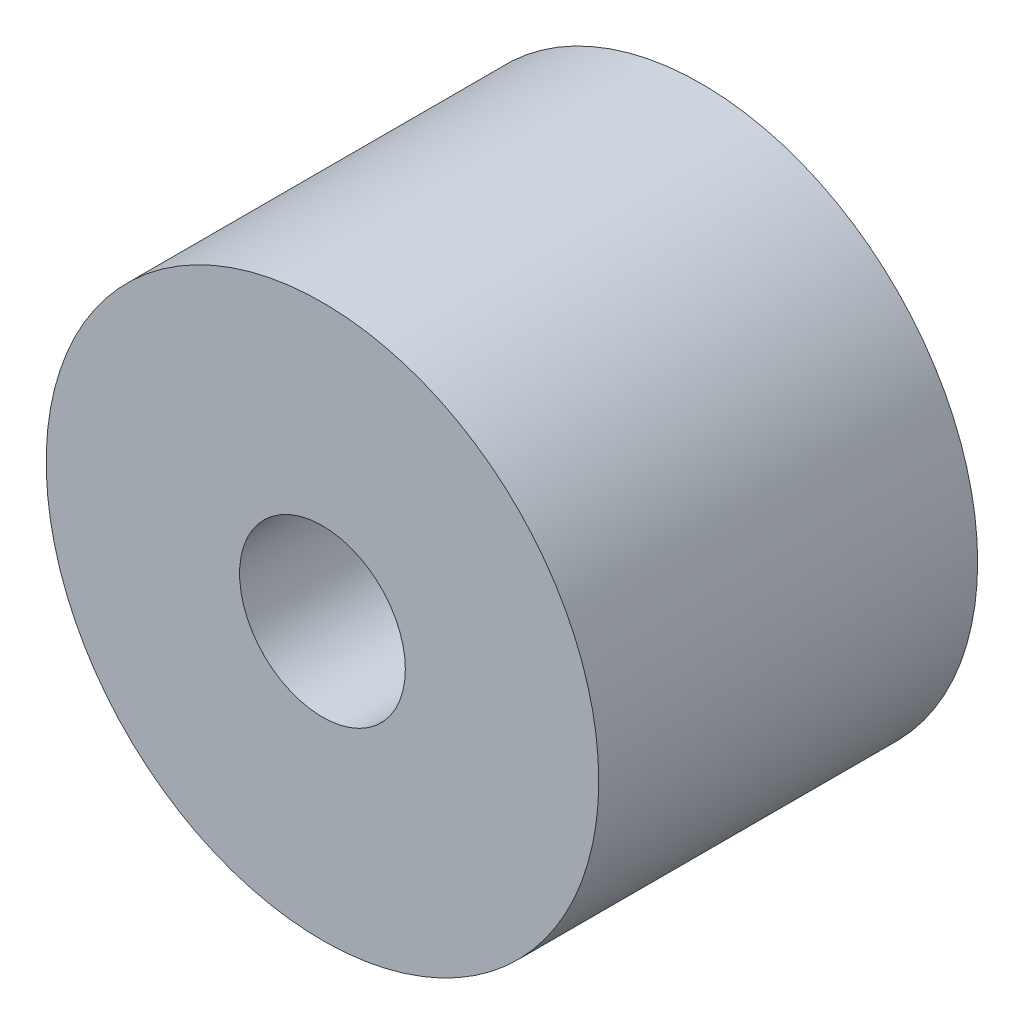
ISO-10303-21;
HEADER;
FILE_DESCRIPTION(('STEP AP214'),'2;1');
FILE_NAME('part.step','',(''),(''),'','','');
FILE_SCHEMA(('AUTOMOTIVE_DESIGN { 1 0 10303 214 1 1 1 1 }'));
ENDSEC;
DATA;
#1=APPLICATION_CONTEXT('core data for automotive mechanical design processes');
#2=APPLICATION_PROTOCOL_DEFINITION('international standard','automotive_design',2000,#1);
#3=PRODUCT_CONTEXT('',#1,'mechanical');
#4=PRODUCT('Part','Part','',(#3));
#5=PRODUCT_RELATED_PRODUCT_CATEGORY('part','',(#4));
#6=PRODUCT_DEFINITION_FORMATION('','',#4);
#7=PRODUCT_DEFINITION_CONTEXT('part definition',#1,'design');
#8=PRODUCT_DEFINITION('design','',#6,#7);
#9=PRODUCT_DEFINITION_SHAPE('','',#8);
#10=(LENGTH_UNIT() NAMED_UNIT(*) SI_UNIT(.MILLI.,.METRE.));
#11=(NAMED_UNIT(*) PLANE_ANGLE_UNIT() SI_UNIT($,.RADIAN.));
#12=(NAMED_UNIT(*) SI_UNIT($,.STERADIAN.) SOLID_ANGLE_UNIT());
#13=UNCERTAINTY_MEASURE_WITH_UNIT(LENGTH_MEASURE(1.E-05),#10,'distance_accuracy_value','');
#14=(GEOMETRIC_REPRESENTATION_CONTEXT(3) GLOBAL_UNCERTAINTY_ASSIGNED_CONTEXT((#13)) GLOBAL_UNIT_ASSIGNED_CONTEXT((#10,
#11,#12)) REPRESENTATION_CONTEXT('',''));
#15=CARTESIAN_POINT('',(0.,0.,0.));
#16=DIRECTION('',(0.,0.,1.));
#17=DIRECTION('',(1.,0.,0.));
#18=AXIS2_PLACEMENT_3D('',#15,#16,#17);
#19=CARTESIAN_POINT('',(0.,0.,24.));
#20=DIRECTION('',(0.,0.,1.));
#21=DIRECTION('',(1.,0.,0.));
#22=AXIS2_PLACEMENT_3D('',#19,#20,#21);
#23=PLANE('',#22);
#24=CARTESIAN_POINT('',(0.,0.,24.));
#25=DIRECTION('',(0.,0.,1.));
#26=DIRECTION('',(1.,0.,0.));
#27=AXIS2_PLACEMENT_3D('',#24,#25,#26);
#28=CIRCLE('',#27,17.5);
#29=CARTESIAN_POINT('',(17.5,0.,24.));
#30=VERTEX_POINT('',#29);
#31=EDGE_CURVE('E10',#30,#30,#28,.T.);
#32=ORIENTED_EDGE('',*,*,#31,.T.);
#33=EDGE_LOOP('',(#32));
#34=FACE_BOUND('',#33,.T.);
#35=CARTESIAN_POINT('',(0.,0.,24.));
#36=DIRECTION('',(0.,0.,1.));
#37=DIRECTION('',(1.,0.,0.));
#38=AXIS2_PLACEMENT_3D('',#35,#36,#37);
#39=CIRCLE('',#38,5.25);
#40=CARTESIAN_POINT('',(5.25,0.,24.));
#41=VERTEX_POINT('',#40);
#42=EDGE_CURVE('E41',#41,#41,#39,.T.);
#43=ORIENTED_EDGE('',*,*,#42,.F.);
#44=EDGE_LOOP('',(#43));
#45=FACE_BOUND('',#44,.T.);
#46=ADVANCED_FACE('F30',(#34,#45),#23,.T.);
#47=CARTESIAN_POINT('',(0.,0.,0.));
#48=DIRECTION('',(0.,0.,1.));
#49=DIRECTION('',(1.,0.,0.));
#50=AXIS2_PLACEMENT_3D('',#47,#48,#49);
#51=PLANE('',#50);
#52=CARTESIAN_POINT('',(0.,0.,0.));
#53=DIRECTION('',(0.,0.,1.));
#54=DIRECTION('',(1.,0.,0.));
#55=AXIS2_PLACEMENT_3D('',#52,#53,#54);
#56=CIRCLE('',#55,17.5);
#57=CARTESIAN_POINT('',(17.5,0.,0.));
#58=VERTEX_POINT('',#57);
#59=EDGE_CURVE('E34',#58,#58,#56,.T.);
#60=ORIENTED_EDGE('',*,*,#59,.F.);
#61=EDGE_LOOP('',(#60));
#62=FACE_BOUND('',#61,.T.);
#63=CARTESIAN_POINT('',(0.,0.,0.));
#64=DIRECTION('',(0.,0.,1.));
#65=DIRECTION('',(1.,0.,0.));
#66=AXIS2_PLACEMENT_3D('',#63,#64,#65);
#67=CIRCLE('',#66,5.25);
#68=CARTESIAN_POINT('',(5.25,0.,0.));
#69=VERTEX_POINT('',#68);
#70=EDGE_CURVE('E43',#69,#69,#67,.T.);
#71=ORIENTED_EDGE('',*,*,#70,.T.);
#72=EDGE_LOOP('',(#71));
#73=FACE_BOUND('',#72,.T.);
#74=ADVANCED_FACE('F53',(#62,#73),#51,.F.);
#75=CARTESIAN_POINT('',(0.,0.,24.));
#76=DIRECTION('',(0.,0.,-1.));
#77=DIRECTION('',(-1.,0.,0.));
#78=AXIS2_PLACEMENT_3D('',#75,#76,#77);
#79=CYLINDRICAL_SURFACE('',#78,17.5);
#80=ORIENTED_EDGE('',*,*,#31,.F.);
#81=EDGE_LOOP('',(#80));
#82=FACE_BOUND('',#81,.T.);
#83=ORIENTED_EDGE('',*,*,#59,.T.);
#84=EDGE_LOOP('',(#83));
#85=FACE_BOUND('',#84,.T.);
#86=ADVANCED_FACE('F32',(#82,#85),#79,.T.);
#87=CARTESIAN_POINT('',(0.,0.,24.));
#88=DIRECTION('',(0.,0.,-1.));
#89=DIRECTION('',(-1.,0.,0.));
#90=AXIS2_PLACEMENT_3D('',#87,#88,#89);
#91=CYLINDRICAL_SURFACE('',#90,5.25);
#92=ORIENTED_EDGE('',*,*,#42,.T.);
#93=EDGE_LOOP('',(#92));
#94=FACE_BOUND('',#93,.T.);
#95=ORIENTED_EDGE('',*,*,#70,.F.);
#96=EDGE_LOOP('',(#95));
#97=FACE_BOUND('',#96,.T.);
#98=ADVANCED_FACE('F49',(#94,#97),#91,.F.);
#99=CLOSED_SHELL('',(#46,#74,#86,#98));
#100=MANIFOLD_SOLID_BREP('B2',#99);
#101=ADVANCED_BREP_SHAPE_REPRESENTATION('',(#18,#100),#14);
#102=SHAPE_DEFINITION_REPRESENTATION(#9,#101);
ENDSEC;
END-ISO-10303-21;
